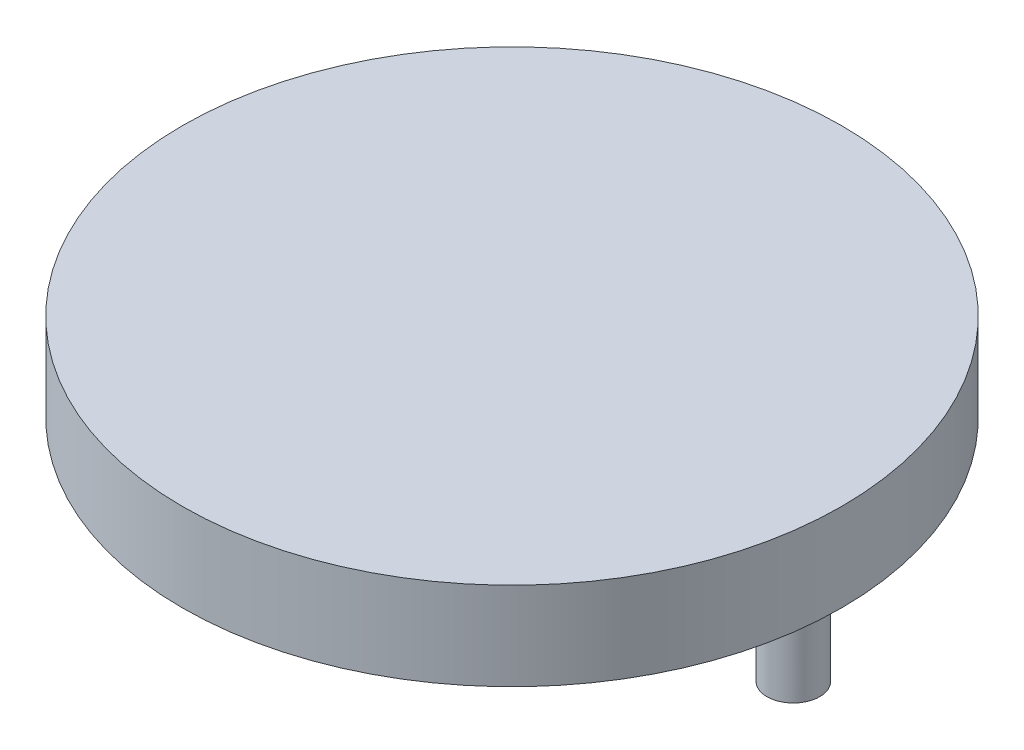
ISO-10303-21;
HEADER;
FILE_DESCRIPTION(('STEP AP214'),'2;1');
FILE_NAME('part.step','',(''),(''),'','','');
FILE_SCHEMA(('AUTOMOTIVE_DESIGN { 1 0 10303 214 1 1 1 1 }'));
ENDSEC;
DATA;
#1=APPLICATION_CONTEXT('core data for automotive mechanical design processes');
#2=APPLICATION_PROTOCOL_DEFINITION('international standard','automotive_design',2000,#1);
#3=PRODUCT_CONTEXT('',#1,'mechanical');
#4=PRODUCT('Part','Part','',(#3));
#5=PRODUCT_RELATED_PRODUCT_CATEGORY('part','',(#4));
#6=PRODUCT_DEFINITION_FORMATION('','',#4);
#7=PRODUCT_DEFINITION_CONTEXT('part definition',#1,'design');
#8=PRODUCT_DEFINITION('design','',#6,#7);
#9=PRODUCT_DEFINITION_SHAPE('','',#8);
#10=(LENGTH_UNIT() NAMED_UNIT(*) SI_UNIT(.MILLI.,.METRE.));
#11=(NAMED_UNIT(*) PLANE_ANGLE_UNIT() SI_UNIT($,.RADIAN.));
#12=(NAMED_UNIT(*) SI_UNIT($,.STERADIAN.) SOLID_ANGLE_UNIT());
#13=UNCERTAINTY_MEASURE_WITH_UNIT(LENGTH_MEASURE(1.E-05),#10,'distance_accuracy_value','');
#14=(GEOMETRIC_REPRESENTATION_CONTEXT(3) GLOBAL_UNCERTAINTY_ASSIGNED_CONTEXT((#13)) GLOBAL_UNIT_ASSIGNED_CONTEXT((#10,
#11,#12)) REPRESENTATION_CONTEXT('',''));
#15=CARTESIAN_POINT('',(0.,0.,0.));
#16=DIRECTION('',(0.,0.,1.));
#17=DIRECTION('',(1.,0.,0.));
#18=AXIS2_PLACEMENT_3D('',#15,#16,#17);
#19=CARTESIAN_POINT('',(0.,0.,0.));
#20=DIRECTION('',(0.,-1.,0.));
#21=DIRECTION('',(0.,0.,-1.));
#22=AXIS2_PLACEMENT_3D('',#19,#20,#21);
#23=CYLINDRICAL_SURFACE('',#22,18.75);
#24=CARTESIAN_POINT('',(0.,11.9405788427861,0.));
#25=DIRECTION('',(0.,-1.,0.));
#26=DIRECTION('',(0.,0.,-1.));
#27=AXIS2_PLACEMENT_3D('',#24,#25,#26);
#28=CIRCLE('',#27,18.75);
#29=CARTESIAN_POINT('',(0.,11.9405788427861,-18.75));
#30=VERTEX_POINT('',#29);
#31=EDGE_CURVE('E44',#30,#30,#28,.T.);
#32=ORIENTED_EDGE('',*,*,#31,.F.);
#33=EDGE_LOOP('',(#32));
#34=FACE_BOUND('',#33,.T.);
#35=CARTESIAN_POINT('',(0.,16.9405788427861,0.));
#36=DIRECTION('',(0.,-1.,0.));
#37=DIRECTION('',(0.,0.,-1.));
#38=AXIS2_PLACEMENT_3D('',#35,#36,#37);
#39=CIRCLE('',#38,18.75);
#40=CARTESIAN_POINT('',(0.,16.9405788427861,-18.75));
#41=VERTEX_POINT('',#40);
#42=EDGE_CURVE('E59',#41,#41,#39,.T.);
#43=ORIENTED_EDGE('',*,*,#42,.T.);
#44=EDGE_LOOP('',(#43));
#45=FACE_BOUND('',#44,.T.);
#46=ADVANCED_FACE('F34',(#34,#45),#23,.T.);
#47=CARTESIAN_POINT('',(0.,11.9405788427861,7.63970234266196));
#48=DIRECTION('',(0.,1.,0.));
#49=DIRECTION('',(0.,0.,1.));
#50=AXIS2_PLACEMENT_3D('',#47,#48,#49);
#51=PLANE('',#50);
#52=CARTESIAN_POINT('',(-16.,11.9405788427861,0.));
#53=DIRECTION('',(0.,1.,0.));
#54=DIRECTION('',(0.,0.,1.));
#55=AXIS2_PLACEMENT_3D('',#52,#53,#54);
#56=CIRCLE('',#55,1.5);
#57=CARTESIAN_POINT('',(-16.,11.9405788427861,1.5));
#58=VERTEX_POINT('',#57);
#59=EDGE_CURVE('E10',#58,#58,#56,.F.);
#60=ORIENTED_EDGE('',*,*,#59,.F.);
#61=EDGE_LOOP('',(#60));
#62=FACE_BOUND('',#61,.T.);
#63=CARTESIAN_POINT('',(16.,11.9405788427861,0.));
#64=DIRECTION('',(0.,1.,0.));
#65=DIRECTION('',(0.,0.,1.));
#66=AXIS2_PLACEMENT_3D('',#63,#64,#65);
#67=CIRCLE('',#66,1.5);
#68=CARTESIAN_POINT('',(16.,11.9405788427861,1.5));
#69=VERTEX_POINT('',#68);
#70=EDGE_CURVE('E40',#69,#69,#67,.F.);
#71=ORIENTED_EDGE('',*,*,#70,.F.);
#72=EDGE_LOOP('',(#71));
#73=FACE_BOUND('',#72,.T.);
#74=CARTESIAN_POINT('',(0.,11.9405788427861,0.));
#75=DIRECTION('',(0.,-1.,0.));
#76=DIRECTION('',(0.,0.,-1.));
#77=AXIS2_PLACEMENT_3D('',#74,#75,#76);
#78=CIRCLE('',#77,7.63970234266196);
#79=CARTESIAN_POINT('',(0.,11.9405788427861,-7.63970234266196));
#80=VERTEX_POINT('',#79);
#81=EDGE_CURVE('E48',#80,#80,#78,.T.);
#82=ORIENTED_EDGE('',*,*,#81,.F.);
#83=EDGE_LOOP('',(#82));
#84=FACE_BOUND('',#83,.T.);
#85=ORIENTED_EDGE('',*,*,#31,.T.);
#86=EDGE_LOOP('',(#85));
#87=FACE_BOUND('',#86,.T.);
#88=ADVANCED_FACE('F84',(#62,#73,#84,#87),#51,.F.);
#89=CARTESIAN_POINT('',(0.,11.9405788427861,0.));
#90=DIRECTION('',(0.,1.,0.));
#91=DIRECTION('',(0.,0.,1.));
#92=AXIS2_PLACEMENT_3D('',#89,#90,#91);
#93=CONICAL_SURFACE('',#92,7.63970234266196,0.34906585039886);
#94=CARTESIAN_POINT('',(0.,2.10627200540333,0.));
#95=DIRECTION('',(0.,-1.,0.));
#96=DIRECTION('',(0.,0.,-1.));
#97=AXIS2_PLACEMENT_3D('',#94,#95,#96);
#98=CIRCLE('',#97,4.06030737921409);
#99=CARTESIAN_POINT('',(0.,2.10627200540333,-4.06030737921409));
#100=VERTEX_POINT('',#99);
#101=EDGE_CURVE('E53',#100,#100,#98,.T.);
#102=ORIENTED_EDGE('',*,*,#101,.F.);
#103=EDGE_LOOP('',(#102));
#104=FACE_BOUND('',#103,.T.);
#105=ORIENTED_EDGE('',*,*,#81,.T.);
#106=EDGE_LOOP('',(#105));
#107=FACE_BOUND('',#106,.T.);
#108=ADVANCED_FACE('F89',(#104,#107),#93,.T.);
#109=CARTESIAN_POINT('',(0.,1.76425186207766,0.));
#110=DIRECTION('',(0.,-1.,0.));
#111=DIRECTION('',(0.,0.,-1.));
#112=AXIS2_PLACEMENT_3D('',#109,#110,#111);
#113=TOROIDAL_SURFACE('',#112,5.,1.);
#114=CARTESIAN_POINT('',(0.,1.76425186207766,0.));
#115=DIRECTION('',(0.,-1.,0.));
#116=DIRECTION('',(0.,0.,-1.));
#117=AXIS2_PLACEMENT_3D('',#114,#115,#116);
#118=CIRCLE('',#117,4.);
#119=CARTESIAN_POINT('',(0.,1.76425186207766,-4.));
#120=VERTEX_POINT('',#119);
#121=EDGE_CURVE('E56',#120,#120,#118,.T.);
#122=ORIENTED_EDGE('',*,*,#121,.F.);
#123=EDGE_LOOP('',(#122));
#124=FACE_BOUND('',#123,.T.);
#125=ORIENTED_EDGE('',*,*,#101,.T.);
#126=EDGE_LOOP('',(#125));
#127=FACE_BOUND('',#126,.T.);
#128=ADVANCED_FACE('F105',(#124,#127),#113,.F.);
#129=CARTESIAN_POINT('',(0.,1.76425186207766,4.));
#130=DIRECTION('',(0.,1.,0.));
#131=DIRECTION('',(0.,0.,1.));
#132=AXIS2_PLACEMENT_3D('',#129,#130,#131);
#133=PLANE('',#132);
#134=ORIENTED_EDGE('',*,*,#121,.T.);
#135=EDGE_LOOP('',(#134));
#136=FACE_BOUND('',#135,.T.);
#137=ADVANCED_FACE('F97',(#136),#133,.F.);
#138=CARTESIAN_POINT('',(0.,16.9405788427861,18.75));
#139=DIRECTION('',(0.,-1.,0.));
#140=DIRECTION('',(0.,0.,-1.));
#141=AXIS2_PLACEMENT_3D('',#138,#139,#140);
#142=PLANE('',#141);
#143=ORIENTED_EDGE('',*,*,#42,.F.);
#144=EDGE_LOOP('',(#143));
#145=FACE_BOUND('',#144,.T.);
#146=ADVANCED_FACE('F95',(#145),#142,.F.);
#147=CARTESIAN_POINT('',(16.,6.94057884278613,0.));
#148=DIRECTION('',(0.,1.,0.));
#149=DIRECTION('',(0.,0.,1.));
#150=AXIS2_PLACEMENT_3D('',#147,#148,#149);
#151=CYLINDRICAL_SURFACE('',#150,1.5);
#152=CARTESIAN_POINT('',(16.,6.94057884278613,0.));
#153=DIRECTION('',(0.,-1.,0.));
#154=DIRECTION('',(0.,0.,-1.));
#155=AXIS2_PLACEMENT_3D('',#152,#153,#154);
#156=CIRCLE('',#155,1.5);
#157=CARTESIAN_POINT('',(16.,6.94057884278613,-1.5));
#158=VERTEX_POINT('',#157);
#159=EDGE_CURVE('E62',#158,#158,#156,.T.);
#160=ORIENTED_EDGE('',*,*,#159,.F.);
#161=EDGE_LOOP('',(#160));
#162=FACE_BOUND('',#161,.T.);
#163=ORIENTED_EDGE('',*,*,#70,.T.);
#164=EDGE_LOOP('',(#163));
#165=FACE_BOUND('',#164,.T.);
#166=ADVANCED_FACE('F80',(#162,#165),#151,.T.);
#167=CARTESIAN_POINT('',(16.,6.94057884278613,0.));
#168=DIRECTION('',(0.,-1.,0.));
#169=DIRECTION('',(0.,0.,-1.));
#170=AXIS2_PLACEMENT_3D('',#167,#168,#169);
#171=PLANE('',#170);
#172=ORIENTED_EDGE('',*,*,#159,.T.);
#173=EDGE_LOOP('',(#172));
#174=FACE_BOUND('',#173,.T.);
#175=ADVANCED_FACE('F73',(#174),#171,.T.);
#176=CARTESIAN_POINT('',(-16.,6.94057884278613,0.));
#177=DIRECTION('',(0.,1.,0.));
#178=DIRECTION('',(0.,0.,1.));
#179=AXIS2_PLACEMENT_3D('',#176,#177,#178);
#180=CYLINDRICAL_SURFACE('',#179,1.5);
#181=CARTESIAN_POINT('',(-16.,6.94057884278613,0.));
#182=DIRECTION('',(0.,-1.,0.));
#183=DIRECTION('',(0.,0.,-1.));
#184=AXIS2_PLACEMENT_3D('',#181,#182,#183);
#185=CIRCLE('',#184,1.5);
#186=CARTESIAN_POINT('',(-16.,6.94057884278613,-1.5));
#187=VERTEX_POINT('',#186);
#188=EDGE_CURVE('E65',#187,#187,#185,.T.);
#189=ORIENTED_EDGE('',*,*,#188,.F.);
#190=EDGE_LOOP('',(#189));
#191=FACE_BOUND('',#190,.T.);
#192=ORIENTED_EDGE('',*,*,#59,.T.);
#193=EDGE_LOOP('',(#192));
#194=FACE_BOUND('',#193,.T.);
#195=ADVANCED_FACE('F71',(#191,#194),#180,.T.);
#196=CARTESIAN_POINT('',(-16.,6.94057884278613,0.));
#197=DIRECTION('',(0.,-1.,0.));
#198=DIRECTION('',(0.,0.,-1.));
#199=AXIS2_PLACEMENT_3D('',#196,#197,#198);
#200=PLANE('',#199);
#201=ORIENTED_EDGE('',*,*,#188,.T.);
#202=EDGE_LOOP('',(#201));
#203=FACE_BOUND('',#202,.T.);
#204=ADVANCED_FACE('F69',(#203),#200,.T.);
#205=CLOSED_SHELL('',(#46,#88,#108,#128,#137,#146,#166,#175,#195,#204));
#206=MANIFOLD_SOLID_BREP('B2',#205);
#207=ADVANCED_BREP_SHAPE_REPRESENTATION('',(#18,#206),#14);
#208=SHAPE_DEFINITION_REPRESENTATION(#9,#207);
ENDSEC;
END-ISO-10303-21;
